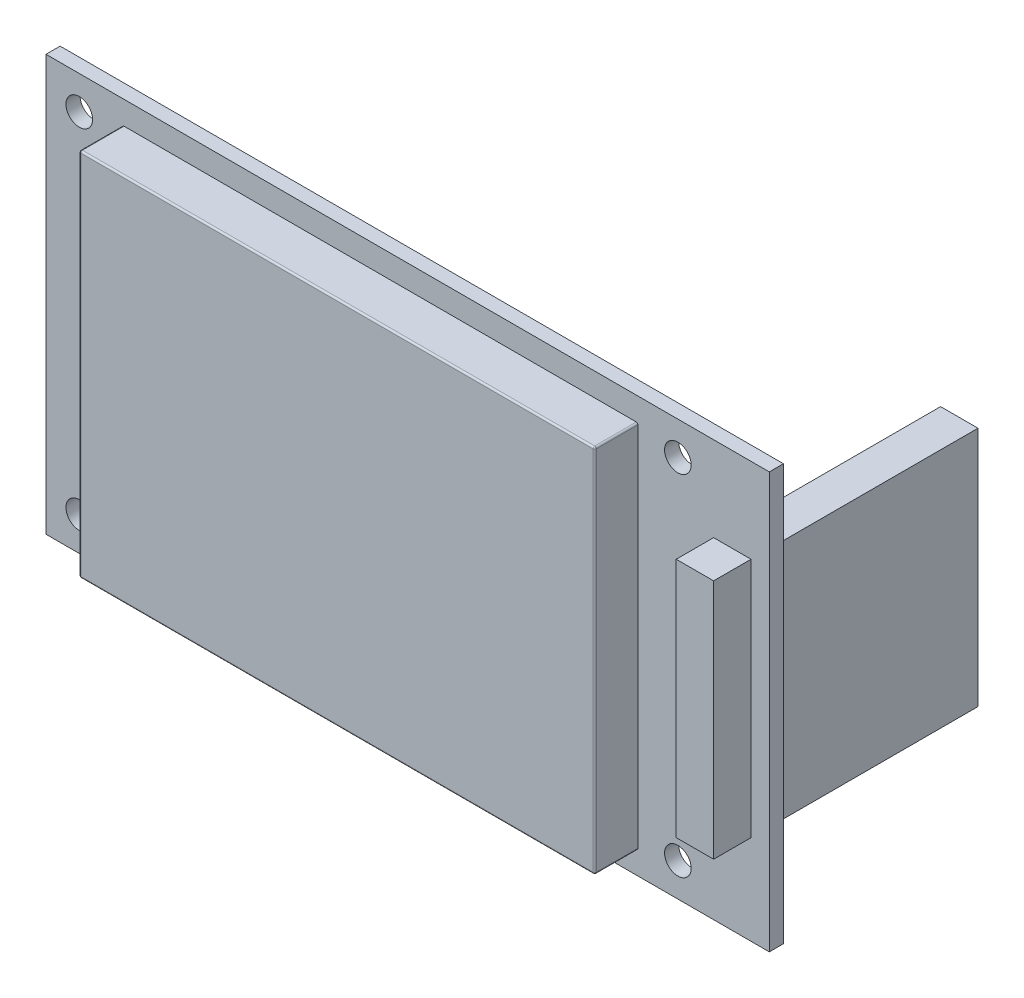
ISO-10303-21;
HEADER;
FILE_DESCRIPTION(('STEP AP214'),'2;1');
FILE_NAME('part.step','',(''),(''),'','','');
FILE_SCHEMA(('AUTOMOTIVE_DESIGN { 1 0 10303 214 1 1 1 1 }'));
ENDSEC;
DATA;
#1=APPLICATION_CONTEXT('core data for automotive mechanical design processes');
#2=APPLICATION_PROTOCOL_DEFINITION('international standard','automotive_design',2000,#1);
#3=PRODUCT_CONTEXT('',#1,'mechanical');
#4=PRODUCT('Part','Part','',(#3));
#5=PRODUCT_RELATED_PRODUCT_CATEGORY('part','',(#4));
#6=PRODUCT_DEFINITION_FORMATION('','',#4);
#7=PRODUCT_DEFINITION_CONTEXT('part definition',#1,'design');
#8=PRODUCT_DEFINITION('design','',#6,#7);
#9=PRODUCT_DEFINITION_SHAPE('','',#8);
#10=(LENGTH_UNIT() NAMED_UNIT(*) SI_UNIT(.MILLI.,.METRE.));
#11=(NAMED_UNIT(*) PLANE_ANGLE_UNIT() SI_UNIT($,.RADIAN.));
#12=(NAMED_UNIT(*) SI_UNIT($,.STERADIAN.) SOLID_ANGLE_UNIT());
#13=UNCERTAINTY_MEASURE_WITH_UNIT(LENGTH_MEASURE(1.E-05),#10,'distance_accuracy_value','');
#14=(GEOMETRIC_REPRESENTATION_CONTEXT(3) GLOBAL_UNCERTAINTY_ASSIGNED_CONTEXT((#13)) GLOBAL_UNIT_ASSIGNED_CONTEXT((#10,
#11,#12)) REPRESENTATION_CONTEXT('',''));
#15=CARTESIAN_POINT('',(0.,0.,0.));
#16=DIRECTION('',(0.,0.,1.));
#17=DIRECTION('',(1.,0.,0.));
#18=AXIS2_PLACEMENT_3D('',#15,#16,#17);
#19=CARTESIAN_POINT('',(0.,0.,1.7));
#20=DIRECTION('',(0.,0.,1.));
#21=DIRECTION('',(1.,0.,0.));
#22=AXIS2_PLACEMENT_3D('',#19,#20,#21);
#23=PLANE('',#22);
#24=DIRECTION('',(0.,-1.,0.));
#25=VECTOR('',#24,1.);
#26=CARTESIAN_POINT('',(36.8,0.,1.7));
#27=LINE('',#26,#25);
#28=CARTESIAN_POINT('',(36.8,14.8,1.7));
#29=VERTEX_POINT('',#28);
#30=CARTESIAN_POINT('',(36.8,-14.2,1.7));
#31=VERTEX_POINT('',#30);
#32=EDGE_CURVE('E32',#29,#31,#27,.T.);
#33=ORIENTED_EDGE('',*,*,#32,.F.);
#34=DIRECTION('',(-1.,0.,0.));
#35=VECTOR('',#34,1.);
#36=CARTESIAN_POINT('',(0.,14.8,1.7));
#37=LINE('',#36,#35);
#38=CARTESIAN_POINT('',(41.3,14.8,1.7));
#39=VERTEX_POINT('',#38);
#40=EDGE_CURVE('E36',#39,#29,#37,.T.);
#41=ORIENTED_EDGE('',*,*,#40,.F.);
#42=DIRECTION('',(0.,1.,0.));
#43=VECTOR('',#42,1.);
#44=CARTESIAN_POINT('',(41.3,0.,1.7));
#45=LINE('',#44,#43);
#46=CARTESIAN_POINT('',(41.3,-14.2,1.7));
#47=VERTEX_POINT('',#46);
#48=EDGE_CURVE('E217',#47,#39,#45,.T.);
#49=ORIENTED_EDGE('',*,*,#48,.F.);
#50=DIRECTION('',(1.,0.,0.));
#51=VECTOR('',#50,1.);
#52=CARTESIAN_POINT('',(0.,-14.2,1.7));
#53=LINE('',#52,#51);
#54=EDGE_CURVE('E207',#31,#47,#53,.T.);
#55=ORIENTED_EDGE('',*,*,#54,.F.);
#56=EDGE_LOOP('',(#33,#41,#49,#55));
#57=FACE_BOUND('',#56,.T.);
#58=CARTESIAN_POINT('',(-39.5,-21.,1.7));
#59=DIRECTION('',(0.,0.,1.));
#60=DIRECTION('',(1.,0.,0.));
#61=AXIS2_PLACEMENT_3D('',#58,#59,#60);
#62=CIRCLE('',#61,1.6);
#63=CARTESIAN_POINT('',(-37.9,-21.,1.7));
#64=VERTEX_POINT('',#63);
#65=EDGE_CURVE('E238',#64,#64,#62,.F.);
#66=ORIENTED_EDGE('',*,*,#65,.T.);
#67=EDGE_LOOP('',(#66));
#68=FACE_BOUND('',#67,.T.);
#69=CARTESIAN_POINT('',(32.5,-21.,1.7));
#70=DIRECTION('',(0.,0.,1.));
#71=DIRECTION('',(1.,0.,0.));
#72=AXIS2_PLACEMENT_3D('',#69,#70,#71);
#73=CIRCLE('',#72,1.6);
#74=CARTESIAN_POINT('',(34.1,-21.,1.7));
#75=VERTEX_POINT('',#74);
#76=EDGE_CURVE('E235',#75,#75,#73,.F.);
#77=ORIENTED_EDGE('',*,*,#76,.T.);
#78=EDGE_LOOP('',(#77));
#79=FACE_BOUND('',#78,.T.);
#80=CARTESIAN_POINT('',(32.5,21.,1.7));
#81=DIRECTION('',(0.,0.,1.));
#82=DIRECTION('',(1.,0.,0.));
#83=AXIS2_PLACEMENT_3D('',#80,#81,#82);
#84=CIRCLE('',#83,1.6);
#85=CARTESIAN_POINT('',(34.1,21.,1.7));
#86=VERTEX_POINT('',#85);
#87=EDGE_CURVE('E225',#86,#86,#84,.F.);
#88=ORIENTED_EDGE('',*,*,#87,.T.);
#89=EDGE_LOOP('',(#88));
#90=FACE_BOUND('',#89,.T.);
#91=CARTESIAN_POINT('',(-39.5,21.,1.7));
#92=DIRECTION('',(0.,0.,1.));
#93=DIRECTION('',(1.,0.,0.));
#94=AXIS2_PLACEMENT_3D('',#91,#92,#93);
#95=CIRCLE('',#94,1.6);
#96=CARTESIAN_POINT('',(-37.9,21.,1.7));
#97=VERTEX_POINT('',#96);
#98=EDGE_CURVE('E244',#97,#97,#95,.F.);
#99=ORIENTED_EDGE('',*,*,#98,.T.);
#100=EDGE_LOOP('',(#99));
#101=FACE_BOUND('',#100,.T.);
#102=DIRECTION('',(0.,-1.,0.));
#103=VECTOR('',#102,1.);
#104=CARTESIAN_POINT('',(-43.5,-25.,1.7));
#105=LINE('',#104,#103);
#106=CARTESIAN_POINT('',(-43.5,25.,1.7));
#107=VERTEX_POINT('',#106);
#108=CARTESIAN_POINT('',(-43.5,-25.,1.7));
#109=VERTEX_POINT('',#108);
#110=EDGE_CURVE('E260',#107,#109,#105,.T.);
#111=ORIENTED_EDGE('',*,*,#110,.T.);
#112=DIRECTION('',(1.,0.,0.));
#113=VECTOR('',#112,1.);
#114=CARTESIAN_POINT('',(43.5,-25.,1.7));
#115=LINE('',#114,#113);
#116=CARTESIAN_POINT('',(43.5,-25.,1.7));
#117=VERTEX_POINT('',#116);
#118=EDGE_CURVE('E263',#109,#117,#115,.T.);
#119=ORIENTED_EDGE('',*,*,#118,.T.);
#120=DIRECTION('',(0.,1.,0.));
#121=VECTOR('',#120,1.);
#122=CARTESIAN_POINT('',(43.5,-25.,1.7));
#123=LINE('',#122,#121);
#124=CARTESIAN_POINT('',(43.5,25.,1.7));
#125=VERTEX_POINT('',#124);
#126=EDGE_CURVE('E266',#117,#125,#123,.T.);
#127=ORIENTED_EDGE('',*,*,#126,.T.);
#128=DIRECTION('',(-1.,0.,0.));
#129=VECTOR('',#128,1.);
#130=CARTESIAN_POINT('',(43.5,25.,1.7));
#131=LINE('',#130,#129);
#132=EDGE_CURVE('E268',#125,#107,#131,.T.);
#133=ORIENTED_EDGE('',*,*,#132,.T.);
#134=EDGE_LOOP('',(#111,#119,#127,#133));
#135=FACE_BOUND('',#134,.T.);
#136=DIRECTION('',(1.,0.,0.));
#137=VECTOR('',#136,1.);
#138=CARTESIAN_POINT('',(-34.3,-22.3,1.7));
#139=LINE('',#138,#137);
#140=CARTESIAN_POINT('',(-34.1,-22.3,1.7));
#141=VERTEX_POINT('',#140);
#142=CARTESIAN_POINT('',(27.5,-22.3,1.7));
#143=VERTEX_POINT('',#142);
#144=EDGE_CURVE('E250',#141,#143,#139,.T.);
#145=ORIENTED_EDGE('',*,*,#144,.F.);
#146=CARTESIAN_POINT('',(-34.1,-22.1,1.7));
#147=DIRECTION('',(0.,0.,1.));
#148=DIRECTION('',(1.,0.,0.));
#149=AXIS2_PLACEMENT_3D('',#146,#147,#148);
#150=CIRCLE('',#149,0.2);
#151=CARTESIAN_POINT('',(-34.3,-22.1,1.7));
#152=VERTEX_POINT('',#151);
#153=EDGE_CURVE('E309',#141,#152,#150,.F.);
#154=ORIENTED_EDGE('',*,*,#153,.T.);
#155=DIRECTION('',(0.,-1.,0.));
#156=VECTOR('',#155,1.);
#157=CARTESIAN_POINT('',(-34.3,22.2,1.7));
#158=LINE('',#157,#156);
#159=CARTESIAN_POINT('',(-34.3,22.,1.7));
#160=VERTEX_POINT('',#159);
#161=EDGE_CURVE('E247',#160,#152,#158,.T.);
#162=ORIENTED_EDGE('',*,*,#161,.F.);
#163=CARTESIAN_POINT('',(-34.1,22.,1.7));
#164=DIRECTION('',(0.,0.,1.));
#165=DIRECTION('',(1.,0.,0.));
#166=AXIS2_PLACEMENT_3D('',#163,#164,#165);
#167=CIRCLE('',#166,0.2);
#168=CARTESIAN_POINT('',(-34.1,22.2,1.7));
#169=VERTEX_POINT('',#168);
#170=EDGE_CURVE('E315',#160,#169,#167,.F.);
#171=ORIENTED_EDGE('',*,*,#170,.T.);
#172=DIRECTION('',(-1.,0.,0.));
#173=VECTOR('',#172,1.);
#174=CARTESIAN_POINT('',(-34.3,22.2,1.7));
#175=LINE('',#174,#173);
#176=CARTESIAN_POINT('',(27.5,22.2,1.7));
#177=VERTEX_POINT('',#176);
#178=EDGE_CURVE('E256',#177,#169,#175,.T.);
#179=ORIENTED_EDGE('',*,*,#178,.F.);
#180=CARTESIAN_POINT('',(27.5,22.,1.7));
#181=DIRECTION('',(0.,0.,1.));
#182=DIRECTION('',(1.,0.,0.));
#183=AXIS2_PLACEMENT_3D('',#180,#181,#182);
#184=CIRCLE('',#183,0.2);
#185=CARTESIAN_POINT('',(27.7,22.,1.7));
#186=VERTEX_POINT('',#185);
#187=EDGE_CURVE('E313',#177,#186,#184,.F.);
#188=ORIENTED_EDGE('',*,*,#187,.T.);
#189=DIRECTION('',(0.,1.,0.));
#190=VECTOR('',#189,1.);
#191=CARTESIAN_POINT('',(27.7,22.2,1.7));
#192=LINE('',#191,#190);
#193=CARTESIAN_POINT('',(27.7,-22.1,1.7));
#194=VERTEX_POINT('',#193);
#195=EDGE_CURVE('E253',#194,#186,#192,.T.);
#196=ORIENTED_EDGE('',*,*,#195,.F.);
#197=CARTESIAN_POINT('',(27.5,-22.1,1.7));
#198=DIRECTION('',(0.,0.,1.));
#199=DIRECTION('',(1.,0.,0.));
#200=AXIS2_PLACEMENT_3D('',#197,#198,#199);
#201=CIRCLE('',#200,0.2);
#202=EDGE_CURVE('E311',#194,#143,#201,.F.);
#203=ORIENTED_EDGE('',*,*,#202,.T.);
#204=EDGE_LOOP('',(#145,#154,#162,#171,#179,#188,#196,#203));
#205=FACE_BOUND('',#204,.T.);
#206=ADVANCED_FACE('F17',(#57,#68,#79,#90,#101,#135,#205),#23,.T.);
#207=CARTESIAN_POINT('',(-43.5,-25.,1.7));
#208=DIRECTION('',(1.,0.,0.));
#209=DIRECTION('',(0.,0.,-1.));
#210=AXIS2_PLACEMENT_3D('',#207,#208,#209);
#211=PLANE('',#210);
#212=DIRECTION('',(0.,-1.,0.));
#213=VECTOR('',#212,1.);
#214=CARTESIAN_POINT('',(-43.5,-25.,0.));
#215=LINE('',#214,#213);
#216=CARTESIAN_POINT('',(-43.5,25.,0.));
#217=VERTEX_POINT('',#216);
#218=CARTESIAN_POINT('',(-43.5,-25.,0.));
#219=VERTEX_POINT('',#218);
#220=EDGE_CURVE('E259',#217,#219,#215,.T.);
#221=ORIENTED_EDGE('',*,*,#220,.T.);
#222=DIRECTION('',(0.,0.,-1.));
#223=VECTOR('',#222,1.);
#224=CARTESIAN_POINT('',(-43.5,-25.,1.7));
#225=LINE('',#224,#223);
#226=EDGE_CURVE('E286',#109,#219,#225,.T.);
#227=ORIENTED_EDGE('',*,*,#226,.F.);
#228=ORIENTED_EDGE('',*,*,#110,.F.);
#229=DIRECTION('',(0.,0.,-1.));
#230=VECTOR('',#229,1.);
#231=CARTESIAN_POINT('',(-43.5,25.,1.7));
#232=LINE('',#231,#230);
#233=EDGE_CURVE('E270',#107,#217,#232,.T.);
#234=ORIENTED_EDGE('',*,*,#233,.T.);
#235=EDGE_LOOP('',(#221,#227,#228,#234));
#236=FACE_BOUND('',#235,.T.);
#237=ADVANCED_FACE('F402',(#236),#211,.F.);
#238=CARTESIAN_POINT('',(43.5,-25.,1.7));
#239=DIRECTION('',(0.,1.,0.));
#240=DIRECTION('',(-1.,0.,0.));
#241=AXIS2_PLACEMENT_3D('',#238,#239,#240);
#242=PLANE('',#241);
#243=DIRECTION('',(1.,0.,0.));
#244=VECTOR('',#243,1.);
#245=CARTESIAN_POINT('',(43.5,-25.,0.));
#246=LINE('',#245,#244);
#247=CARTESIAN_POINT('',(43.5,-25.,0.));
#248=VERTEX_POINT('',#247);
#249=EDGE_CURVE('E273',#219,#248,#246,.T.);
#250=ORIENTED_EDGE('',*,*,#249,.T.);
#251=DIRECTION('',(0.,0.,-1.));
#252=VECTOR('',#251,1.);
#253=CARTESIAN_POINT('',(43.5,-25.,1.7));
#254=LINE('',#253,#252);
#255=EDGE_CURVE('E283',#117,#248,#254,.T.);
#256=ORIENTED_EDGE('',*,*,#255,.F.);
#257=ORIENTED_EDGE('',*,*,#118,.F.);
#258=ORIENTED_EDGE('',*,*,#226,.T.);
#259=EDGE_LOOP('',(#250,#256,#257,#258));
#260=FACE_BOUND('',#259,.T.);
#261=ADVANCED_FACE('F408',(#260),#242,.F.);
#262=CARTESIAN_POINT('',(43.5,-25.,1.7));
#263=DIRECTION('',(-1.,0.,0.));
#264=DIRECTION('',(0.,0.,1.));
#265=AXIS2_PLACEMENT_3D('',#262,#263,#264);
#266=PLANE('',#265);
#267=DIRECTION('',(0.,1.,0.));
#268=VECTOR('',#267,1.);
#269=CARTESIAN_POINT('',(43.5,-25.,0.));
#270=LINE('',#269,#268);
#271=CARTESIAN_POINT('',(43.5,25.,0.));
#272=VERTEX_POINT('',#271);
#273=EDGE_CURVE('E275',#248,#272,#270,.T.);
#274=ORIENTED_EDGE('',*,*,#273,.T.);
#275=DIRECTION('',(0.,0.,-1.));
#276=VECTOR('',#275,1.);
#277=CARTESIAN_POINT('',(43.5,25.,1.7));
#278=LINE('',#277,#276);
#279=EDGE_CURVE('E280',#125,#272,#278,.T.);
#280=ORIENTED_EDGE('',*,*,#279,.F.);
#281=ORIENTED_EDGE('',*,*,#126,.F.);
#282=ORIENTED_EDGE('',*,*,#255,.T.);
#283=EDGE_LOOP('',(#274,#280,#281,#282));
#284=FACE_BOUND('',#283,.T.);
#285=ADVANCED_FACE('F421',(#284),#266,.F.);
#286=CARTESIAN_POINT('',(43.5,25.,1.7));
#287=DIRECTION('',(0.,-1.,0.));
#288=DIRECTION('',(1.,0.,0.));
#289=AXIS2_PLACEMENT_3D('',#286,#287,#288);
#290=PLANE('',#289);
#291=DIRECTION('',(-1.,0.,0.));
#292=VECTOR('',#291,1.);
#293=CARTESIAN_POINT('',(43.5,25.,0.));
#294=LINE('',#293,#292);
#295=EDGE_CURVE('E264',#272,#217,#294,.T.);
#296=ORIENTED_EDGE('',*,*,#295,.T.);
#297=ORIENTED_EDGE('',*,*,#233,.F.);
#298=ORIENTED_EDGE('',*,*,#132,.F.);
#299=ORIENTED_EDGE('',*,*,#279,.T.);
#300=EDGE_LOOP('',(#296,#297,#298,#299));
#301=FACE_BOUND('',#300,.T.);
#302=ADVANCED_FACE('F418',(#301),#290,.F.);
#303=CARTESIAN_POINT('',(0.,0.,0.));
#304=DIRECTION('',(0.,0.,1.));
#305=DIRECTION('',(1.,0.,0.));
#306=AXIS2_PLACEMENT_3D('',#303,#304,#305);
#307=PLANE('',#306);
#308=DIRECTION('',(-1.,0.,0.));
#309=VECTOR('',#308,1.);
#310=CARTESIAN_POINT('',(0.,14.8,0.));
#311=LINE('',#310,#309);
#312=CARTESIAN_POINT('',(41.3,14.8,0.));
#313=VERTEX_POINT('',#312);
#314=CARTESIAN_POINT('',(36.8,14.8,0.));
#315=VERTEX_POINT('',#314);
#316=EDGE_CURVE('E25',#313,#315,#311,.T.);
#317=ORIENTED_EDGE('',*,*,#316,.T.);
#318=DIRECTION('',(0.,-1.,0.));
#319=VECTOR('',#318,1.);
#320=CARTESIAN_POINT('',(36.8,0.,0.));
#321=LINE('',#320,#319);
#322=CARTESIAN_POINT('',(36.8,-14.2,0.));
#323=VERTEX_POINT('',#322);
#324=EDGE_CURVE('E11',#315,#323,#321,.T.);
#325=ORIENTED_EDGE('',*,*,#324,.T.);
#326=DIRECTION('',(1.,0.,0.));
#327=VECTOR('',#326,1.);
#328=CARTESIAN_POINT('',(0.,-14.2,0.));
#329=LINE('',#328,#327);
#330=CARTESIAN_POINT('',(41.3,-14.2,0.));
#331=VERTEX_POINT('',#330);
#332=EDGE_CURVE('E343',#323,#331,#329,.T.);
#333=ORIENTED_EDGE('',*,*,#332,.T.);
#334=DIRECTION('',(0.,1.,0.));
#335=VECTOR('',#334,1.);
#336=CARTESIAN_POINT('',(41.3,0.,0.));
#337=LINE('',#336,#335);
#338=EDGE_CURVE('E366',#331,#313,#337,.T.);
#339=ORIENTED_EDGE('',*,*,#338,.T.);
#340=EDGE_LOOP('',(#317,#325,#333,#339));
#341=FACE_BOUND('',#340,.T.);
#342=CARTESIAN_POINT('',(-39.5,-21.,0.));
#343=DIRECTION('',(0.,0.,1.));
#344=DIRECTION('',(1.,0.,0.));
#345=AXIS2_PLACEMENT_3D('',#342,#343,#344);
#346=CIRCLE('',#345,1.6);
#347=CARTESIAN_POINT('',(-37.9,-21.,0.));
#348=VERTEX_POINT('',#347);
#349=EDGE_CURVE('E222',#348,#348,#346,.T.);
#350=ORIENTED_EDGE('',*,*,#349,.T.);
#351=EDGE_LOOP('',(#350));
#352=FACE_BOUND('',#351,.T.);
#353=CARTESIAN_POINT('',(32.5,-21.,0.));
#354=DIRECTION('',(0.,0.,1.));
#355=DIRECTION('',(1.,0.,0.));
#356=AXIS2_PLACEMENT_3D('',#353,#354,#355);
#357=CIRCLE('',#356,1.6);
#358=CARTESIAN_POINT('',(34.1,-21.,0.));
#359=VERTEX_POINT('',#358);
#360=EDGE_CURVE('E226',#359,#359,#357,.T.);
#361=ORIENTED_EDGE('',*,*,#360,.T.);
#362=EDGE_LOOP('',(#361));
#363=FACE_BOUND('',#362,.T.);
#364=CARTESIAN_POINT('',(32.5,21.,0.));
#365=DIRECTION('',(0.,0.,1.));
#366=DIRECTION('',(1.,0.,0.));
#367=AXIS2_PLACEMENT_3D('',#364,#365,#366);
#368=CIRCLE('',#367,1.6);
#369=CARTESIAN_POINT('',(34.1,21.,0.));
#370=VERTEX_POINT('',#369);
#371=EDGE_CURVE('E229',#370,#370,#368,.T.);
#372=ORIENTED_EDGE('',*,*,#371,.T.);
#373=EDGE_LOOP('',(#372));
#374=FACE_BOUND('',#373,.T.);
#375=CARTESIAN_POINT('',(-39.5,21.,0.));
#376=DIRECTION('',(0.,0.,1.));
#377=DIRECTION('',(1.,0.,0.));
#378=AXIS2_PLACEMENT_3D('',#375,#376,#377);
#379=CIRCLE('',#378,1.6);
#380=CARTESIAN_POINT('',(-37.9,21.,0.));
#381=VERTEX_POINT('',#380);
#382=EDGE_CURVE('E241',#381,#381,#379,.T.);
#383=ORIENTED_EDGE('',*,*,#382,.T.);
#384=EDGE_LOOP('',(#383));
#385=FACE_BOUND('',#384,.T.);
#386=ORIENTED_EDGE('',*,*,#220,.F.);
#387=ORIENTED_EDGE('',*,*,#295,.F.);
#388=ORIENTED_EDGE('',*,*,#273,.F.);
#389=ORIENTED_EDGE('',*,*,#249,.F.);
#390=EDGE_LOOP('',(#386,#387,#388,#389));
#391=FACE_BOUND('',#390,.T.);
#392=ADVANCED_FACE('F370',(#341,#352,#363,#374,#385,#391),#307,.F.);
#393=CARTESIAN_POINT('',(-34.3,22.2,6.9));
#394=DIRECTION('',(1.,0.,0.));
#395=DIRECTION('',(0.,1.,0.));
#396=AXIS2_PLACEMENT_3D('',#393,#394,#395);
#397=PLANE('',#396);
#398=DIRECTION('',(0.,0.,-1.));
#399=VECTOR('',#398,1.);
#400=CARTESIAN_POINT('',(-34.3,-22.1,6.9));
#401=LINE('',#400,#399);
#402=CARTESIAN_POINT('',(-34.3,-22.1,6.7));
#403=VERTEX_POINT('',#402);
#404=EDGE_CURVE('E296',#152,#403,#401,.F.);
#405=ORIENTED_EDGE('',*,*,#404,.T.);
#406=DIRECTION('',(0.,-1.,0.));
#407=VECTOR('',#406,1.);
#408=CARTESIAN_POINT('',(-34.3,22.,6.7));
#409=LINE('',#408,#407);
#410=CARTESIAN_POINT('',(-34.3,22.,6.7));
#411=VERTEX_POINT('',#410);
#412=EDGE_CURVE('E329',#403,#411,#409,.F.);
#413=ORIENTED_EDGE('',*,*,#412,.T.);
#414=DIRECTION('',(0.,0.,-1.));
#415=VECTOR('',#414,1.);
#416=CARTESIAN_POINT('',(-34.3,22.,6.9));
#417=LINE('',#416,#415);
#418=EDGE_CURVE('E294',#411,#160,#417,.T.);
#419=ORIENTED_EDGE('',*,*,#418,.T.);
#420=ORIENTED_EDGE('',*,*,#161,.T.);
#421=EDGE_LOOP('',(#405,#413,#419,#420));
#422=FACE_BOUND('',#421,.T.);
#423=ADVANCED_FACE('F414',(#422),#397,.F.);
#424=CARTESIAN_POINT('',(-34.3,-22.3,6.9));
#425=DIRECTION('',(0.,1.,0.));
#426=DIRECTION('',(0.,0.,1.));
#427=AXIS2_PLACEMENT_3D('',#424,#425,#426);
#428=PLANE('',#427);
#429=DIRECTION('',(0.,0.,-1.));
#430=VECTOR('',#429,1.);
#431=CARTESIAN_POINT('',(27.5,-22.3,6.9));
#432=LINE('',#431,#430);
#433=CARTESIAN_POINT('',(27.5,-22.3,6.7));
#434=VERTEX_POINT('',#433);
#435=EDGE_CURVE('E289',#143,#434,#432,.F.);
#436=ORIENTED_EDGE('',*,*,#435,.T.);
#437=DIRECTION('',(1.,0.,0.));
#438=VECTOR('',#437,1.);
#439=CARTESIAN_POINT('',(-34.1,-22.3,6.7));
#440=LINE('',#439,#438);
#441=CARTESIAN_POINT('',(-34.1,-22.3,6.7));
#442=VERTEX_POINT('',#441);
#443=EDGE_CURVE('E341',#434,#442,#440,.F.);
#444=ORIENTED_EDGE('',*,*,#443,.T.);
#445=DIRECTION('',(0.,0.,-1.));
#446=VECTOR('',#445,1.);
#447=CARTESIAN_POINT('',(-34.1,-22.3,6.9));
#448=LINE('',#447,#446);
#449=EDGE_CURVE('E292',#442,#141,#448,.T.);
#450=ORIENTED_EDGE('',*,*,#449,.T.);
#451=ORIENTED_EDGE('',*,*,#144,.T.);
#452=EDGE_LOOP('',(#436,#444,#450,#451));
#453=FACE_BOUND('',#452,.T.);
#454=ADVANCED_FACE('F515',(#453),#428,.F.);
#455=CARTESIAN_POINT('',(27.7,22.2,6.9));
#456=DIRECTION('',(-1.,0.,0.));
#457=DIRECTION('',(0.,-1.,0.));
#458=AXIS2_PLACEMENT_3D('',#455,#456,#457);
#459=PLANE('',#458);
#460=DIRECTION('',(0.,0.,-1.));
#461=VECTOR('',#460,1.);
#462=CARTESIAN_POINT('',(27.7,22.,6.9));
#463=LINE('',#462,#461);
#464=CARTESIAN_POINT('',(27.7,22.,6.7));
#465=VERTEX_POINT('',#464);
#466=EDGE_CURVE('E299',#186,#465,#463,.F.);
#467=ORIENTED_EDGE('',*,*,#466,.T.);
#468=DIRECTION('',(0.,1.,0.));
#469=VECTOR('',#468,1.);
#470=CARTESIAN_POINT('',(27.7,-22.1,6.7));
#471=LINE('',#470,#469);
#472=CARTESIAN_POINT('',(27.7,-22.1,6.7));
#473=VERTEX_POINT('',#472);
#474=EDGE_CURVE('E337',#465,#473,#471,.F.);
#475=ORIENTED_EDGE('',*,*,#474,.T.);
#476=DIRECTION('',(0.,0.,-1.));
#477=VECTOR('',#476,1.);
#478=CARTESIAN_POINT('',(27.7,-22.1,6.9));
#479=LINE('',#478,#477);
#480=EDGE_CURVE('E302',#473,#194,#479,.T.);
#481=ORIENTED_EDGE('',*,*,#480,.T.);
#482=ORIENTED_EDGE('',*,*,#195,.T.);
#483=EDGE_LOOP('',(#467,#475,#481,#482));
#484=FACE_BOUND('',#483,.T.);
#485=ADVANCED_FACE('F487',(#484),#459,.F.);
#486=CARTESIAN_POINT('',(-34.3,22.2,6.9));
#487=DIRECTION('',(0.,-1.,0.));
#488=DIRECTION('',(0.,0.,-1.));
#489=AXIS2_PLACEMENT_3D('',#486,#487,#488);
#490=PLANE('',#489);
#491=DIRECTION('',(0.,0.,-1.));
#492=VECTOR('',#491,1.);
#493=CARTESIAN_POINT('',(-34.1,22.2,6.9));
#494=LINE('',#493,#492);
#495=CARTESIAN_POINT('',(-34.1,22.2,6.7));
#496=VERTEX_POINT('',#495);
#497=EDGE_CURVE('E304',#169,#496,#494,.F.);
#498=ORIENTED_EDGE('',*,*,#497,.T.);
#499=DIRECTION('',(-1.,0.,0.));
#500=VECTOR('',#499,1.);
#501=CARTESIAN_POINT('',(27.5,22.2,6.7));
#502=LINE('',#501,#500);
#503=CARTESIAN_POINT('',(27.5,22.2,6.7));
#504=VERTEX_POINT('',#503);
#505=EDGE_CURVE('E333',#496,#504,#502,.F.);
#506=ORIENTED_EDGE('',*,*,#505,.T.);
#507=DIRECTION('',(0.,0.,-1.));
#508=VECTOR('',#507,1.);
#509=CARTESIAN_POINT('',(27.5,22.2,6.9));
#510=LINE('',#509,#508);
#511=EDGE_CURVE('E307',#504,#177,#510,.T.);
#512=ORIENTED_EDGE('',*,*,#511,.T.);
#513=ORIENTED_EDGE('',*,*,#178,.T.);
#514=EDGE_LOOP('',(#498,#506,#512,#513));
#515=FACE_BOUND('',#514,.T.);
#516=ADVANCED_FACE('F498',(#515),#490,.F.);
#517=CARTESIAN_POINT('',(0.,0.,6.9));
#518=DIRECTION('',(0.,0.,1.));
#519=DIRECTION('',(1.,0.,0.));
#520=AXIS2_PLACEMENT_3D('',#517,#518,#519);
#521=PLANE('',#520);
#522=DIRECTION('',(-1.,0.,0.));
#523=VECTOR('',#522,1.);
#524=CARTESIAN_POINT('',(-34.1,22.,6.9));
#525=LINE('',#524,#523);
#526=CARTESIAN_POINT('',(27.5,22.,6.9));
#527=VERTEX_POINT('',#526);
#528=CARTESIAN_POINT('',(-34.1,22.,6.9));
#529=VERTEX_POINT('',#528);
#530=EDGE_CURVE('E324',#527,#529,#525,.T.);
#531=ORIENTED_EDGE('',*,*,#530,.T.);
#532=DIRECTION('',(0.,-1.,0.));
#533=VECTOR('',#532,1.);
#534=CARTESIAN_POINT('',(-34.1,-22.1,6.9));
#535=LINE('',#534,#533);
#536=CARTESIAN_POINT('',(-34.1,-22.1,6.9));
#537=VERTEX_POINT('',#536);
#538=EDGE_CURVE('E326',#529,#537,#535,.T.);
#539=ORIENTED_EDGE('',*,*,#538,.T.);
#540=DIRECTION('',(1.,0.,0.));
#541=VECTOR('',#540,1.);
#542=CARTESIAN_POINT('',(27.5,-22.1,6.9));
#543=LINE('',#542,#541);
#544=CARTESIAN_POINT('',(27.5,-22.1,6.9));
#545=VERTEX_POINT('',#544);
#546=EDGE_CURVE('E320',#537,#545,#543,.T.);
#547=ORIENTED_EDGE('',*,*,#546,.T.);
#548=DIRECTION('',(0.,1.,0.));
#549=VECTOR('',#548,1.);
#550=CARTESIAN_POINT('',(27.5,22.,6.9));
#551=LINE('',#550,#549);
#552=EDGE_CURVE('E322',#545,#527,#551,.T.);
#553=ORIENTED_EDGE('',*,*,#552,.T.);
#554=EDGE_LOOP('',(#531,#539,#547,#553));
#555=FACE_BOUND('',#554,.T.);
#556=ADVANCED_FACE('F507',(#555),#521,.T.);
#557=CARTESIAN_POINT('',(-39.5,21.,6.9));
#558=DIRECTION('',(0.,0.,-1.));
#559=DIRECTION('',(-1.,0.,0.));
#560=AXIS2_PLACEMENT_3D('',#557,#558,#559);
#561=CYLINDRICAL_SURFACE('',#560,1.6);
#562=ORIENTED_EDGE('',*,*,#98,.F.);
#563=EDGE_LOOP('',(#562));
#564=FACE_BOUND('',#563,.T.);
#565=ORIENTED_EDGE('',*,*,#382,.F.);
#566=EDGE_LOOP('',(#565));
#567=FACE_BOUND('',#566,.T.);
#568=ADVANCED_FACE('F537',(#564,#567),#561,.F.);
#569=CARTESIAN_POINT('',(32.5,21.,6.9));
#570=DIRECTION('',(0.,0.,-1.));
#571=DIRECTION('',(-1.,0.,0.));
#572=AXIS2_PLACEMENT_3D('',#569,#570,#571);
#573=CYLINDRICAL_SURFACE('',#572,1.6);
#574=ORIENTED_EDGE('',*,*,#87,.F.);
#575=EDGE_LOOP('',(#574));
#576=FACE_BOUND('',#575,.T.);
#577=ORIENTED_EDGE('',*,*,#371,.F.);
#578=EDGE_LOOP('',(#577));
#579=FACE_BOUND('',#578,.T.);
#580=ADVANCED_FACE('F540',(#576,#579),#573,.F.);
#581=CARTESIAN_POINT('',(32.5,-21.,6.9));
#582=DIRECTION('',(0.,0.,-1.));
#583=DIRECTION('',(-1.,0.,0.));
#584=AXIS2_PLACEMENT_3D('',#581,#582,#583);
#585=CYLINDRICAL_SURFACE('',#584,1.6);
#586=ORIENTED_EDGE('',*,*,#76,.F.);
#587=EDGE_LOOP('',(#586));
#588=FACE_BOUND('',#587,.T.);
#589=ORIENTED_EDGE('',*,*,#360,.F.);
#590=EDGE_LOOP('',(#589));
#591=FACE_BOUND('',#590,.T.);
#592=ADVANCED_FACE('F544',(#588,#591),#585,.F.);
#593=CARTESIAN_POINT('',(-39.5,-21.,6.9));
#594=DIRECTION('',(0.,0.,-1.));
#595=DIRECTION('',(-1.,0.,0.));
#596=AXIS2_PLACEMENT_3D('',#593,#594,#595);
#597=CYLINDRICAL_SURFACE('',#596,1.6);
#598=ORIENTED_EDGE('',*,*,#65,.F.);
#599=EDGE_LOOP('',(#598));
#600=FACE_BOUND('',#599,.T.);
#601=ORIENTED_EDGE('',*,*,#349,.F.);
#602=EDGE_LOOP('',(#601));
#603=FACE_BOUND('',#602,.T.);
#604=ADVANCED_FACE('F433',(#600,#603),#597,.F.);
#605=CARTESIAN_POINT('',(-34.1,-22.1,6.9));
#606=DIRECTION('',(0.,0.,-1.));
#607=DIRECTION('',(-1.,0.,0.));
#608=AXIS2_PLACEMENT_3D('',#605,#606,#607);
#609=CYLINDRICAL_SURFACE('',#608,0.2);
#610=ORIENTED_EDGE('',*,*,#449,.F.);
#611=CARTESIAN_POINT('',(-34.1,-22.1,6.7));
#612=DIRECTION('',(0.,0.,-1.));
#613=DIRECTION('',(-1.,0.,0.));
#614=AXIS2_PLACEMENT_3D('',#611,#612,#613);
#615=CIRCLE('',#614,0.2);
#616=EDGE_CURVE('E317',#442,#403,#615,.T.);
#617=ORIENTED_EDGE('',*,*,#616,.T.);
#618=ORIENTED_EDGE('',*,*,#404,.F.);
#619=ORIENTED_EDGE('',*,*,#153,.F.);
#620=EDGE_LOOP('',(#610,#617,#618,#619));
#621=FACE_BOUND('',#620,.T.);
#622=ADVANCED_FACE('F429',(#621),#609,.T.);
#623=CARTESIAN_POINT('',(27.5,-22.1,6.9));
#624=DIRECTION('',(0.,0.,-1.));
#625=DIRECTION('',(-1.,0.,0.));
#626=AXIS2_PLACEMENT_3D('',#623,#624,#625);
#627=CYLINDRICAL_SURFACE('',#626,0.2);
#628=ORIENTED_EDGE('',*,*,#480,.F.);
#629=CARTESIAN_POINT('',(27.5,-22.1,6.7));
#630=DIRECTION('',(0.,0.,-1.));
#631=DIRECTION('',(-1.,0.,0.));
#632=AXIS2_PLACEMENT_3D('',#629,#630,#631);
#633=CIRCLE('',#632,0.2);
#634=EDGE_CURVE('E339',#473,#434,#633,.T.);
#635=ORIENTED_EDGE('',*,*,#634,.T.);
#636=ORIENTED_EDGE('',*,*,#435,.F.);
#637=ORIENTED_EDGE('',*,*,#202,.F.);
#638=EDGE_LOOP('',(#628,#635,#636,#637));
#639=FACE_BOUND('',#638,.T.);
#640=ADVANCED_FACE('F432',(#639),#627,.T.);
#641=CARTESIAN_POINT('',(27.5,22.,6.9));
#642=DIRECTION('',(0.,0.,-1.));
#643=DIRECTION('',(-1.,0.,0.));
#644=AXIS2_PLACEMENT_3D('',#641,#642,#643);
#645=CYLINDRICAL_SURFACE('',#644,0.2);
#646=ORIENTED_EDGE('',*,*,#511,.F.);
#647=CARTESIAN_POINT('',(27.5,22.,6.7));
#648=DIRECTION('',(0.,0.,-1.));
#649=DIRECTION('',(-1.,0.,0.));
#650=AXIS2_PLACEMENT_3D('',#647,#648,#649);
#651=CIRCLE('',#650,0.2);
#652=EDGE_CURVE('E335',#504,#465,#651,.T.);
#653=ORIENTED_EDGE('',*,*,#652,.T.);
#654=ORIENTED_EDGE('',*,*,#466,.F.);
#655=ORIENTED_EDGE('',*,*,#187,.F.);
#656=EDGE_LOOP('',(#646,#653,#654,#655));
#657=FACE_BOUND('',#656,.T.);
#658=ADVANCED_FACE('F437',(#657),#645,.T.);
#659=CARTESIAN_POINT('',(-34.1,22.,6.9));
#660=DIRECTION('',(0.,0.,-1.));
#661=DIRECTION('',(-1.,0.,0.));
#662=AXIS2_PLACEMENT_3D('',#659,#660,#661);
#663=CYLINDRICAL_SURFACE('',#662,0.2);
#664=ORIENTED_EDGE('',*,*,#418,.F.);
#665=CARTESIAN_POINT('',(-34.1,22.,6.7));
#666=DIRECTION('',(0.,0.,-1.));
#667=DIRECTION('',(-1.,0.,0.));
#668=AXIS2_PLACEMENT_3D('',#665,#666,#667);
#669=CIRCLE('',#668,0.2);
#670=EDGE_CURVE('E331',#411,#496,#669,.T.);
#671=ORIENTED_EDGE('',*,*,#670,.T.);
#672=ORIENTED_EDGE('',*,*,#497,.F.);
#673=ORIENTED_EDGE('',*,*,#170,.F.);
#674=EDGE_LOOP('',(#664,#671,#672,#673));
#675=FACE_BOUND('',#674,.T.);
#676=ADVANCED_FACE('F441',(#675),#663,.T.);
#677=CARTESIAN_POINT('',(27.5,22.,6.7));
#678=DIRECTION('',(0.,0.,1.));
#679=DIRECTION('',(1.,0.,0.));
#680=AXIS2_PLACEMENT_3D('',#677,#678,#679);
#681=SPHERICAL_SURFACE('',#680,0.2);
#682=CARTESIAN_POINT('',(27.5,22.,6.7));
#683=DIRECTION('',(0.,-1.,0.));
#684=DIRECTION('',(0.,0.,-1.));
#685=AXIS2_PLACEMENT_3D('',#682,#683,#684);
#686=CIRCLE('',#685,0.2);
#687=EDGE_CURVE('E359',#465,#527,#686,.T.);
#688=ORIENTED_EDGE('',*,*,#687,.F.);
#689=ORIENTED_EDGE('',*,*,#652,.F.);
#690=CARTESIAN_POINT('',(27.5,22.,6.7));
#691=DIRECTION('',(-1.,0.,0.));
#692=DIRECTION('',(0.,0.,1.));
#693=AXIS2_PLACEMENT_3D('',#690,#691,#692);
#694=CIRCLE('',#693,0.2);
#695=EDGE_CURVE('E232',#527,#504,#694,.T.);
#696=ORIENTED_EDGE('',*,*,#695,.F.);
#697=EDGE_LOOP('',(#688,#689,#696));
#698=FACE_BOUND('',#697,.T.);
#699=ADVANCED_FACE('F19',(#698),#681,.T.);
#700=CARTESIAN_POINT('',(0.,22.,6.7));
#701=DIRECTION('',(1.,0.,0.));
#702=DIRECTION('',(0.,0.,-1.));
#703=AXIS2_PLACEMENT_3D('',#700,#701,#702);
#704=CYLINDRICAL_SURFACE('',#703,0.2);
#705=ORIENTED_EDGE('',*,*,#695,.T.);
#706=ORIENTED_EDGE('',*,*,#505,.F.);
#707=CARTESIAN_POINT('',(-34.1,22.,6.7));
#708=DIRECTION('',(-1.,0.,0.));
#709=DIRECTION('',(0.,0.,1.));
#710=AXIS2_PLACEMENT_3D('',#707,#708,#709);
#711=CIRCLE('',#710,0.2);
#712=EDGE_CURVE('E356',#529,#496,#711,.T.);
#713=ORIENTED_EDGE('',*,*,#712,.F.);
#714=ORIENTED_EDGE('',*,*,#530,.F.);
#715=EDGE_LOOP('',(#705,#706,#713,#714));
#716=FACE_BOUND('',#715,.T.);
#717=ADVANCED_FACE('F467',(#716),#704,.T.);
#718=CARTESIAN_POINT('',(27.5,0.,6.7));
#719=DIRECTION('',(0.,-1.,0.));
#720=DIRECTION('',(1.,0.,0.));
#721=AXIS2_PLACEMENT_3D('',#718,#719,#720);
#722=CYLINDRICAL_SURFACE('',#721,0.2);
#723=ORIENTED_EDGE('',*,*,#687,.T.);
#724=ORIENTED_EDGE('',*,*,#552,.F.);
#725=CARTESIAN_POINT('',(27.5,-22.1,6.7));
#726=DIRECTION('',(0.,-1.,0.));
#727=DIRECTION('',(0.,0.,-1.));
#728=AXIS2_PLACEMENT_3D('',#725,#726,#727);
#729=CIRCLE('',#728,0.2);
#730=EDGE_CURVE('E353',#473,#545,#729,.T.);
#731=ORIENTED_EDGE('',*,*,#730,.F.);
#732=ORIENTED_EDGE('',*,*,#474,.F.);
#733=EDGE_LOOP('',(#723,#724,#731,#732));
#734=FACE_BOUND('',#733,.T.);
#735=ADVANCED_FACE('F464',(#734),#722,.T.);
#736=CARTESIAN_POINT('',(-34.1,22.,6.7));
#737=DIRECTION('',(0.,0.,1.));
#738=DIRECTION('',(1.,0.,0.));
#739=AXIS2_PLACEMENT_3D('',#736,#737,#738);
#740=SPHERICAL_SURFACE('',#739,0.2);
#741=ORIENTED_EDGE('',*,*,#712,.T.);
#742=ORIENTED_EDGE('',*,*,#670,.F.);
#743=CARTESIAN_POINT('',(-34.1,22.,6.7));
#744=DIRECTION('',(0.,-1.,0.));
#745=DIRECTION('',(0.,0.,-1.));
#746=AXIS2_PLACEMENT_3D('',#743,#744,#745);
#747=CIRCLE('',#746,0.2);
#748=EDGE_CURVE('E350',#529,#411,#747,.T.);
#749=ORIENTED_EDGE('',*,*,#748,.F.);
#750=EDGE_LOOP('',(#741,#742,#749));
#751=FACE_BOUND('',#750,.T.);
#752=ADVANCED_FACE('F460',(#751),#740,.T.);
#753=CARTESIAN_POINT('',(27.5,-22.1,6.7));
#754=DIRECTION('',(0.,0.,1.));
#755=DIRECTION('',(1.,0.,0.));
#756=AXIS2_PLACEMENT_3D('',#753,#754,#755);
#757=SPHERICAL_SURFACE('',#756,0.2);
#758=ORIENTED_EDGE('',*,*,#634,.F.);
#759=ORIENTED_EDGE('',*,*,#730,.T.);
#760=CARTESIAN_POINT('',(27.5,-22.1,6.7));
#761=DIRECTION('',(-1.,0.,0.));
#762=DIRECTION('',(0.,0.,1.));
#763=AXIS2_PLACEMENT_3D('',#760,#761,#762);
#764=CIRCLE('',#763,0.2);
#765=EDGE_CURVE('E347',#434,#545,#764,.T.);
#766=ORIENTED_EDGE('',*,*,#765,.F.);
#767=EDGE_LOOP('',(#758,#759,#766));
#768=FACE_BOUND('',#767,.T.);
#769=ADVANCED_FACE('F456',(#768),#757,.T.);
#770=CARTESIAN_POINT('',(-34.1,0.,6.7));
#771=DIRECTION('',(0.,1.,0.));
#772=DIRECTION('',(-1.,0.,0.));
#773=AXIS2_PLACEMENT_3D('',#770,#771,#772);
#774=CYLINDRICAL_SURFACE('',#773,0.2);
#775=ORIENTED_EDGE('',*,*,#748,.T.);
#776=ORIENTED_EDGE('',*,*,#412,.F.);
#777=CARTESIAN_POINT('',(-34.1,-22.1,6.7));
#778=DIRECTION('',(0.,-1.,0.));
#779=DIRECTION('',(0.,0.,-1.));
#780=AXIS2_PLACEMENT_3D('',#777,#778,#779);
#781=CIRCLE('',#780,0.2);
#782=EDGE_CURVE('E345',#537,#403,#781,.T.);
#783=ORIENTED_EDGE('',*,*,#782,.F.);
#784=ORIENTED_EDGE('',*,*,#538,.F.);
#785=EDGE_LOOP('',(#775,#776,#783,#784));
#786=FACE_BOUND('',#785,.T.);
#787=ADVANCED_FACE('F452',(#786),#774,.T.);
#788=CARTESIAN_POINT('',(0.,-22.1,6.7));
#789=DIRECTION('',(-1.,0.,0.));
#790=DIRECTION('',(0.,0.,1.));
#791=AXIS2_PLACEMENT_3D('',#788,#789,#790);
#792=CYLINDRICAL_SURFACE('',#791,0.2);
#793=ORIENTED_EDGE('',*,*,#765,.T.);
#794=ORIENTED_EDGE('',*,*,#546,.F.);
#795=CARTESIAN_POINT('',(-34.1,-22.1,6.7));
#796=DIRECTION('',(-1.,0.,0.));
#797=DIRECTION('',(0.,0.,1.));
#798=AXIS2_PLACEMENT_3D('',#795,#796,#797);
#799=CIRCLE('',#798,0.2);
#800=EDGE_CURVE('E221',#442,#537,#799,.T.);
#801=ORIENTED_EDGE('',*,*,#800,.F.);
#802=ORIENTED_EDGE('',*,*,#443,.F.);
#803=EDGE_LOOP('',(#793,#794,#801,#802));
#804=FACE_BOUND('',#803,.T.);
#805=ADVANCED_FACE('F448',(#804),#792,.T.);
#806=CARTESIAN_POINT('',(-34.1,-22.1,6.7));
#807=DIRECTION('',(0.,0.,1.));
#808=DIRECTION('',(1.,0.,0.));
#809=AXIS2_PLACEMENT_3D('',#806,#807,#808);
#810=SPHERICAL_SURFACE('',#809,0.2);
#811=ORIENTED_EDGE('',*,*,#782,.T.);
#812=ORIENTED_EDGE('',*,*,#616,.F.);
#813=ORIENTED_EDGE('',*,*,#800,.T.);
#814=EDGE_LOOP('',(#811,#812,#813));
#815=FACE_BOUND('',#814,.T.);
#816=ADVANCED_FACE('F397',(#815),#810,.T.);
#817=CARTESIAN_POINT('',(0.,0.,-25.6));
#818=DIRECTION('',(0.,0.,1.));
#819=DIRECTION('',(1.,0.,0.));
#820=AXIS2_PLACEMENT_3D('',#817,#818,#819);
#821=PLANE('',#820);
#822=DIRECTION('',(0.,-1.,0.));
#823=VECTOR('',#822,1.);
#824=CARTESIAN_POINT('',(36.8,14.8,-25.6));
#825=LINE('',#824,#823);
#826=CARTESIAN_POINT('',(36.8,14.8,-25.6));
#827=VERTEX_POINT('',#826);
#828=CARTESIAN_POINT('',(36.8,-14.2,-25.6));
#829=VERTEX_POINT('',#828);
#830=EDGE_CURVE('E193',#827,#829,#825,.T.);
#831=ORIENTED_EDGE('',*,*,#830,.F.);
#832=DIRECTION('',(-1.,0.,0.));
#833=VECTOR('',#832,1.);
#834=CARTESIAN_POINT('',(36.8,14.8,-25.6));
#835=LINE('',#834,#833);
#836=CARTESIAN_POINT('',(41.3,14.8,-25.6));
#837=VERTEX_POINT('',#836);
#838=EDGE_CURVE('E173',#837,#827,#835,.T.);
#839=ORIENTED_EDGE('',*,*,#838,.F.);
#840=DIRECTION('',(0.,1.,0.));
#841=VECTOR('',#840,1.);
#842=CARTESIAN_POINT('',(41.3,14.8,-25.6));
#843=LINE('',#842,#841);
#844=CARTESIAN_POINT('',(41.3,-14.2,-25.6));
#845=VERTEX_POINT('',#844);
#846=EDGE_CURVE('E199',#845,#837,#843,.T.);
#847=ORIENTED_EDGE('',*,*,#846,.F.);
#848=DIRECTION('',(1.,0.,0.));
#849=VECTOR('',#848,1.);
#850=CARTESIAN_POINT('',(36.8,-14.2,-25.6));
#851=LINE('',#850,#849);
#852=EDGE_CURVE('E196',#829,#845,#851,.T.);
#853=ORIENTED_EDGE('',*,*,#852,.F.);
#854=EDGE_LOOP('',(#831,#839,#847,#853));
#855=FACE_BOUND('',#854,.T.);
#856=ADVANCED_FACE('F382',(#855),#821,.F.);
#857=CARTESIAN_POINT('',(36.8,-14.2,-25.6));
#858=DIRECTION('',(0.,-1.,0.));
#859=DIRECTION('',(0.,0.,-1.));
#860=AXIS2_PLACEMENT_3D('',#857,#858,#859);
#861=PLANE('',#860);
#862=ORIENTED_EDGE('',*,*,#332,.F.);
#863=DIRECTION('',(0.,0.,1.));
#864=VECTOR('',#863,1.);
#865=CARTESIAN_POINT('',(36.8,-14.2,-25.6));
#866=LINE('',#865,#864);
#867=EDGE_CURVE('E172',#829,#323,#866,.T.);
#868=ORIENTED_EDGE('',*,*,#867,.F.);
#869=ORIENTED_EDGE('',*,*,#852,.T.);
#870=DIRECTION('',(0.,0.,1.));
#871=VECTOR('',#870,1.);
#872=CARTESIAN_POINT('',(41.3,-14.2,-25.6));
#873=LINE('',#872,#871);
#874=EDGE_CURVE('E213',#845,#331,#873,.T.);
#875=ORIENTED_EDGE('',*,*,#874,.T.);
#876=EDGE_LOOP('',(#862,#868,#869,#875));
#877=FACE_BOUND('',#876,.T.);
#878=ADVANCED_FACE('F386',(#877),#861,.T.);
#879=CARTESIAN_POINT('',(41.3,14.8,-25.6));
#880=DIRECTION('',(1.,0.,0.));
#881=DIRECTION('',(0.,1.,0.));
#882=AXIS2_PLACEMENT_3D('',#879,#880,#881);
#883=PLANE('',#882);
#884=ORIENTED_EDGE('',*,*,#338,.F.);
#885=ORIENTED_EDGE('',*,*,#874,.F.);
#886=ORIENTED_EDGE('',*,*,#846,.T.);
#887=DIRECTION('',(0.,0.,1.));
#888=VECTOR('',#887,1.);
#889=CARTESIAN_POINT('',(41.3,14.8,-25.6));
#890=LINE('',#889,#888);
#891=EDGE_CURVE('E209',#837,#313,#890,.T.);
#892=ORIENTED_EDGE('',*,*,#891,.T.);
#893=EDGE_LOOP('',(#884,#885,#886,#892));
#894=FACE_BOUND('',#893,.T.);
#895=ADVANCED_FACE('F376',(#894),#883,.T.);
#896=CARTESIAN_POINT('',(36.8,14.8,-25.6));
#897=DIRECTION('',(0.,1.,0.));
#898=DIRECTION('',(0.,0.,1.));
#899=AXIS2_PLACEMENT_3D('',#896,#897,#898);
#900=PLANE('',#899);
#901=ORIENTED_EDGE('',*,*,#316,.F.);
#902=ORIENTED_EDGE('',*,*,#891,.F.);
#903=ORIENTED_EDGE('',*,*,#838,.T.);
#904=DIRECTION('',(0.,0.,1.));
#905=VECTOR('',#904,1.);
#906=CARTESIAN_POINT('',(36.8,14.8,-25.6));
#907=LINE('',#906,#905);
#908=EDGE_CURVE('E204',#827,#315,#907,.T.);
#909=ORIENTED_EDGE('',*,*,#908,.T.);
#910=EDGE_LOOP('',(#901,#902,#903,#909));
#911=FACE_BOUND('',#910,.T.);
#912=ADVANCED_FACE('F374',(#911),#900,.T.);
#913=CARTESIAN_POINT('',(36.8,14.8,-25.6));
#914=DIRECTION('',(-1.,0.,0.));
#915=DIRECTION('',(0.,-1.,0.));
#916=AXIS2_PLACEMENT_3D('',#913,#914,#915);
#917=PLANE('',#916);
#918=ORIENTED_EDGE('',*,*,#324,.F.);
#919=ORIENTED_EDGE('',*,*,#908,.F.);
#920=ORIENTED_EDGE('',*,*,#830,.T.);
#921=ORIENTED_EDGE('',*,*,#867,.T.);
#922=EDGE_LOOP('',(#918,#919,#920,#921));
#923=FACE_BOUND('',#922,.T.);
#924=ADVANCED_FACE('F384',(#923),#917,.T.);
#925=CARTESIAN_POINT('',(36.8,14.8,6.2));
#926=VERTEX_POINT('',#925);
#927=EDGE_CURVE('E208',#29,#926,#907,.T.);
#928=ORIENTED_EDGE('',*,*,#927,.F.);
#929=ORIENTED_EDGE('',*,*,#32,.T.);
#930=CARTESIAN_POINT('',(36.8,-14.2,6.2));
#931=VERTEX_POINT('',#930);
#932=EDGE_CURVE('E164',#31,#931,#866,.T.);
#933=ORIENTED_EDGE('',*,*,#932,.T.);
#934=DIRECTION('',(0.,-1.,0.));
#935=VECTOR('',#934,1.);
#936=CARTESIAN_POINT('',(36.8,14.8,6.2));
#937=LINE('',#936,#935);
#938=EDGE_CURVE('E169',#926,#931,#937,.T.);
#939=ORIENTED_EDGE('',*,*,#938,.F.);
#940=EDGE_LOOP('',(#928,#929,#933,#939));
#941=FACE_BOUND('',#940,.T.);
#942=ADVANCED_FACE('F167',(#941),#917,.T.);
#943=CARTESIAN_POINT('',(41.3,14.8,6.2));
#944=VERTEX_POINT('',#943);
#945=EDGE_CURVE('E212',#39,#944,#890,.T.);
#946=ORIENTED_EDGE('',*,*,#945,.F.);
#947=ORIENTED_EDGE('',*,*,#40,.T.);
#948=ORIENTED_EDGE('',*,*,#927,.T.);
#949=DIRECTION('',(-1.,0.,0.));
#950=VECTOR('',#949,1.);
#951=CARTESIAN_POINT('',(36.8,14.8,6.2));
#952=LINE('',#951,#950);
#953=EDGE_CURVE('E188',#944,#926,#952,.T.);
#954=ORIENTED_EDGE('',*,*,#953,.F.);
#955=EDGE_LOOP('',(#946,#947,#948,#954));
#956=FACE_BOUND('',#955,.T.);
#957=ADVANCED_FACE('F552',(#956),#900,.T.);
#958=CARTESIAN_POINT('',(41.3,-14.2,6.2));
#959=VERTEX_POINT('',#958);
#960=EDGE_CURVE('E179',#47,#959,#873,.T.);
#961=ORIENTED_EDGE('',*,*,#960,.F.);
#962=ORIENTED_EDGE('',*,*,#48,.T.);
#963=ORIENTED_EDGE('',*,*,#945,.T.);
#964=DIRECTION('',(0.,1.,0.));
#965=VECTOR('',#964,1.);
#966=CARTESIAN_POINT('',(41.3,14.8,6.2));
#967=LINE('',#966,#965);
#968=EDGE_CURVE('E183',#959,#944,#967,.T.);
#969=ORIENTED_EDGE('',*,*,#968,.F.);
#970=EDGE_LOOP('',(#961,#962,#963,#969));
#971=FACE_BOUND('',#970,.T.);
#972=ADVANCED_FACE('F396',(#971),#883,.T.);
#973=ORIENTED_EDGE('',*,*,#932,.F.);
#974=ORIENTED_EDGE('',*,*,#54,.T.);
#975=ORIENTED_EDGE('',*,*,#960,.T.);
#976=DIRECTION('',(1.,0.,0.));
#977=VECTOR('',#976,1.);
#978=CARTESIAN_POINT('',(36.8,-14.2,6.2));
#979=LINE('',#978,#977);
#980=EDGE_CURVE('E176',#931,#959,#979,.T.);
#981=ORIENTED_EDGE('',*,*,#980,.F.);
#982=EDGE_LOOP('',(#973,#974,#975,#981));
#983=FACE_BOUND('',#982,.T.);
#984=ADVANCED_FACE('F177',(#983),#861,.T.);
#985=CARTESIAN_POINT('',(0.,0.,6.2));
#986=DIRECTION('',(0.,0.,1.));
#987=DIRECTION('',(1.,0.,0.));
#988=AXIS2_PLACEMENT_3D('',#985,#986,#987);
#989=PLANE('',#988);
#990=ORIENTED_EDGE('',*,*,#938,.T.);
#991=ORIENTED_EDGE('',*,*,#980,.T.);
#992=ORIENTED_EDGE('',*,*,#968,.T.);
#993=ORIENTED_EDGE('',*,*,#953,.T.);
#994=EDGE_LOOP('',(#990,#991,#992,#993));
#995=FACE_BOUND('',#994,.T.);
#996=ADVANCED_FACE('F186',(#995),#989,.T.);
#997=CLOSED_SHELL('',(#206,#237,#261,#285,#302,#392,#423,#454,#485,#516,#556,#568,#580,#592,
#604,#622,#640,#658,#676,#699,#717,#735,#752,#769,#787,#805,#816,#856,#878,#895,#912,#924,#942,
#957,#972,#984,#996));
#998=MANIFOLD_SOLID_BREP('B1',#997);
#999=ADVANCED_BREP_SHAPE_REPRESENTATION('',(#18,#998),#14);
#1000=SHAPE_DEFINITION_REPRESENTATION(#9,#999);
ENDSEC;
END-ISO-10303-21;
